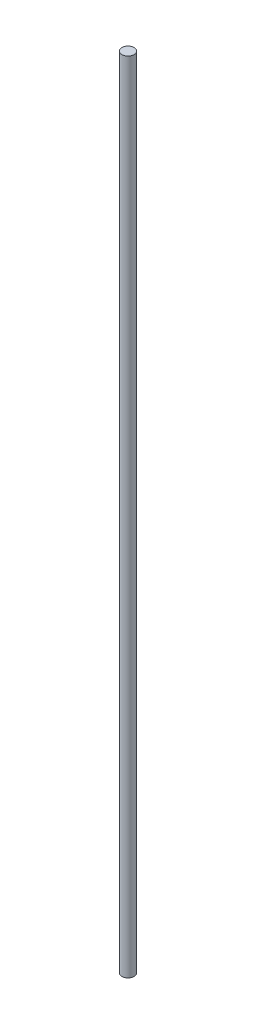
ISO-10303-21;
HEADER;
FILE_DESCRIPTION(('STEP AP214'),'2;1');
FILE_NAME('part.step','',(''),(''),'','','');
FILE_SCHEMA(('AUTOMOTIVE_DESIGN { 1 0 10303 214 1 1 1 1 }'));
ENDSEC;
DATA;
#1=APPLICATION_CONTEXT('core data for automotive mechanical design processes');
#2=APPLICATION_PROTOCOL_DEFINITION('international standard','automotive_design',2000,#1);
#3=PRODUCT_CONTEXT('',#1,'mechanical');
#4=PRODUCT('Part','Part','',(#3));
#5=PRODUCT_RELATED_PRODUCT_CATEGORY('part','',(#4));
#6=PRODUCT_DEFINITION_FORMATION('','',#4);
#7=PRODUCT_DEFINITION_CONTEXT('part definition',#1,'design');
#8=PRODUCT_DEFINITION('design','',#6,#7);
#9=PRODUCT_DEFINITION_SHAPE('','',#8);
#10=(LENGTH_UNIT() NAMED_UNIT(*) SI_UNIT(.MILLI.,.METRE.));
#11=(NAMED_UNIT(*) PLANE_ANGLE_UNIT() SI_UNIT($,.RADIAN.));
#12=(NAMED_UNIT(*) SI_UNIT($,.STERADIAN.) SOLID_ANGLE_UNIT());
#13=UNCERTAINTY_MEASURE_WITH_UNIT(LENGTH_MEASURE(1.E-05),#10,'distance_accuracy_value','');
#14=(GEOMETRIC_REPRESENTATION_CONTEXT(3) GLOBAL_UNCERTAINTY_ASSIGNED_CONTEXT((#13)) GLOBAL_UNIT_ASSIGNED_CONTEXT((#10,
#11,#12)) REPRESENTATION_CONTEXT('',''));
#15=CARTESIAN_POINT('',(0.,0.,0.));
#16=DIRECTION('',(0.,0.,1.));
#17=DIRECTION('',(1.,0.,0.));
#18=AXIS2_PLACEMENT_3D('',#15,#16,#17);
#19=CARTESIAN_POINT('',(0.,-195.,0.));
#20=DIRECTION('',(0.,1.,0.));
#21=DIRECTION('',(0.,0.,1.));
#22=AXIS2_PLACEMENT_3D('',#19,#20,#21);
#23=CYLINDRICAL_SURFACE('',#22,3.);
#24=CARTESIAN_POINT('',(0.,-195.,0.));
#25=DIRECTION('',(0.,1.,0.));
#26=DIRECTION('',(0.,0.,1.));
#27=AXIS2_PLACEMENT_3D('',#24,#25,#26);
#28=CIRCLE('',#27,3.);
#29=CARTESIAN_POINT('',(0.,-195.,3.));
#30=VERTEX_POINT('',#29);
#31=EDGE_CURVE('E10',#30,#30,#28,.T.);
#32=ORIENTED_EDGE('',*,*,#31,.T.);
#33=EDGE_LOOP('',(#32));
#34=FACE_BOUND('',#33,.T.);
#35=CARTESIAN_POINT('',(0.,195.,0.));
#36=DIRECTION('',(0.,1.,0.));
#37=DIRECTION('',(0.,0.,1.));
#38=AXIS2_PLACEMENT_3D('',#35,#36,#37);
#39=CIRCLE('',#38,3.);
#40=CARTESIAN_POINT('',(0.,195.,3.));
#41=VERTEX_POINT('',#40);
#42=EDGE_CURVE('E48',#41,#41,#39,.T.);
#43=ORIENTED_EDGE('',*,*,#42,.F.);
#44=EDGE_LOOP('',(#43));
#45=FACE_BOUND('',#44,.T.);
#46=ADVANCED_FACE('F41',(#34,#45),#23,.T.);
#47=CARTESIAN_POINT('',(0.,-195.,0.));
#48=DIRECTION('',(0.,1.,0.));
#49=DIRECTION('',(0.,0.,1.));
#50=AXIS2_PLACEMENT_3D('',#47,#48,#49);
#51=PLANE('',#50);
#52=ORIENTED_EDGE('',*,*,#31,.F.);
#53=EDGE_LOOP('',(#52));
#54=FACE_BOUND('',#53,.T.);
#55=ADVANCED_FACE('F58',(#54),#51,.F.);
#56=CARTESIAN_POINT('',(0.,195.,0.));
#57=DIRECTION('',(0.,1.,0.));
#58=DIRECTION('',(0.,0.,1.));
#59=AXIS2_PLACEMENT_3D('',#56,#57,#58);
#60=PLANE('',#59);
#61=ORIENTED_EDGE('',*,*,#42,.T.);
#62=EDGE_LOOP('',(#61));
#63=FACE_BOUND('',#62,.T.);
#64=ADVANCED_FACE('F55',(#63),#60,.T.);
#65=CLOSED_SHELL('',(#46,#55,#64));
#66=MANIFOLD_SOLID_BREP('B2',#65);
#67=ADVANCED_BREP_SHAPE_REPRESENTATION('',(#18,#66),#14);
#68=SHAPE_DEFINITION_REPRESENTATION(#9,#67);
ENDSEC;
END-ISO-10303-21;
